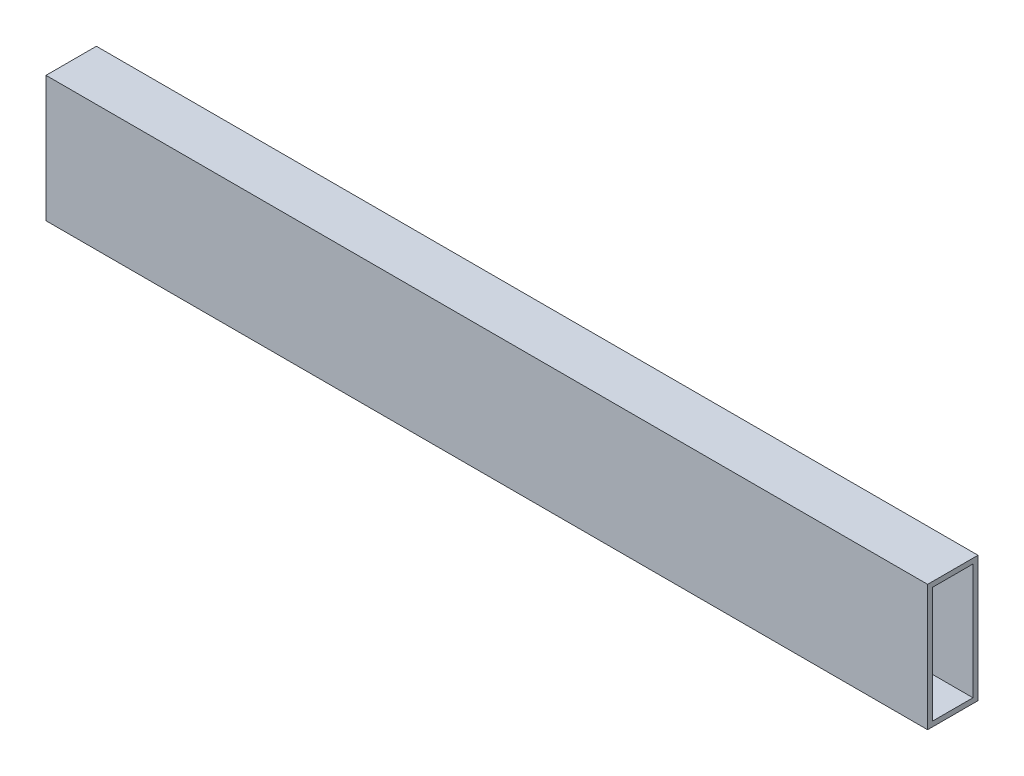
ISO-10303-21;
HEADER;
FILE_DESCRIPTION(('STEP AP214'),'2;1');
FILE_NAME('part.step','',(''),(''),'','','');
FILE_SCHEMA(('AUTOMOTIVE_DESIGN { 1 0 10303 214 1 1 1 1 }'));
ENDSEC;
DATA;
#1=APPLICATION_CONTEXT('core data for automotive mechanical design processes');
#2=APPLICATION_PROTOCOL_DEFINITION('international standard','automotive_design',2000,#1);
#3=PRODUCT_CONTEXT('',#1,'mechanical');
#4=PRODUCT('Part','Part','',(#3));
#5=PRODUCT_RELATED_PRODUCT_CATEGORY('part','',(#4));
#6=PRODUCT_DEFINITION_FORMATION('','',#4);
#7=PRODUCT_DEFINITION_CONTEXT('part definition',#1,'design');
#8=PRODUCT_DEFINITION('design','',#6,#7);
#9=PRODUCT_DEFINITION_SHAPE('','',#8);
#10=(LENGTH_UNIT() NAMED_UNIT(*) SI_UNIT(.MILLI.,.METRE.));
#11=(NAMED_UNIT(*) PLANE_ANGLE_UNIT() SI_UNIT($,.RADIAN.));
#12=(NAMED_UNIT(*) SI_UNIT($,.STERADIAN.) SOLID_ANGLE_UNIT());
#13=UNCERTAINTY_MEASURE_WITH_UNIT(LENGTH_MEASURE(1.E-05),#10,'distance_accuracy_value','');
#14=(GEOMETRIC_REPRESENTATION_CONTEXT(3) GLOBAL_UNCERTAINTY_ASSIGNED_CONTEXT((#13)) GLOBAL_UNIT_ASSIGNED_CONTEXT((#10,
#11,#12)) REPRESENTATION_CONTEXT('',''));
#15=CARTESIAN_POINT('',(0.,0.,0.));
#16=DIRECTION('',(0.,0.,1.));
#17=DIRECTION('',(1.,0.,0.));
#18=AXIS2_PLACEMENT_3D('',#15,#16,#17);
#19=CARTESIAN_POINT('',(350.,0.,0.));
#20=DIRECTION('',(-1.,0.,0.));
#21=DIRECTION('',(0.,0.,1.));
#22=AXIS2_PLACEMENT_3D('',#19,#20,#21);
#23=PLANE('',#22);
#24=DIRECTION('',(0.,1.,0.));
#25=VECTOR('',#24,1.);
#26=CARTESIAN_POINT('',(350.,-25.,-10.));
#27=LINE('',#26,#25);
#28=CARTESIAN_POINT('',(350.,-25.,-10.));
#29=VERTEX_POINT('',#28);
#30=CARTESIAN_POINT('',(350.,25.,-10.));
#31=VERTEX_POINT('',#30);
#32=EDGE_CURVE('E153',#29,#31,#27,.T.);
#33=ORIENTED_EDGE('',*,*,#32,.T.);
#34=DIRECTION('',(0.,0.,1.));
#35=VECTOR('',#34,1.);
#36=CARTESIAN_POINT('',(350.,25.,10.));
#37=LINE('',#36,#35);
#38=CARTESIAN_POINT('',(350.,25.,10.));
#39=VERTEX_POINT('',#38);
#40=EDGE_CURVE('E157',#31,#39,#37,.T.);
#41=ORIENTED_EDGE('',*,*,#40,.T.);
#42=DIRECTION('',(0.,-1.,0.));
#43=VECTOR('',#42,1.);
#44=CARTESIAN_POINT('',(350.,-25.,10.));
#45=LINE('',#44,#43);
#46=CARTESIAN_POINT('',(350.,-25.,10.));
#47=VERTEX_POINT('',#46);
#48=EDGE_CURVE('E161',#39,#47,#45,.T.);
#49=ORIENTED_EDGE('',*,*,#48,.T.);
#50=DIRECTION('',(0.,0.,-1.));
#51=VECTOR('',#50,1.);
#52=CARTESIAN_POINT('',(350.,-25.,10.));
#53=LINE('',#52,#51);
#54=EDGE_CURVE('E164',#47,#29,#53,.T.);
#55=ORIENTED_EDGE('',*,*,#54,.T.);
#56=EDGE_LOOP('',(#33,#41,#49,#55));
#57=FACE_BOUND('',#56,.T.);
#58=DIRECTION('',(0.,1.,0.));
#59=VECTOR('',#58,1.);
#60=CARTESIAN_POINT('',(350.,-23.,-7.99999999999999));
#61=LINE('',#60,#59);
#62=CARTESIAN_POINT('',(350.,-23.,-7.99999999999999));
#63=VERTEX_POINT('',#62);
#64=CARTESIAN_POINT('',(350.,23.,-7.99999999999999));
#65=VERTEX_POINT('',#64);
#66=EDGE_CURVE('E105',#63,#65,#61,.T.);
#67=ORIENTED_EDGE('',*,*,#66,.F.);
#68=DIRECTION('',(0.,0.,-1.));
#69=VECTOR('',#68,1.);
#70=CARTESIAN_POINT('',(350.,-23.,8.));
#71=LINE('',#70,#69);
#72=CARTESIAN_POINT('',(350.,-23.,8.));
#73=VERTEX_POINT('',#72);
#74=EDGE_CURVE('E131',#73,#63,#71,.T.);
#75=ORIENTED_EDGE('',*,*,#74,.F.);
#76=DIRECTION('',(0.,-1.,0.));
#77=VECTOR('',#76,1.);
#78=CARTESIAN_POINT('',(350.,-23.,8.));
#79=LINE('',#78,#77);
#80=CARTESIAN_POINT('',(350.,23.,8.));
#81=VERTEX_POINT('',#80);
#82=EDGE_CURVE('E127',#81,#73,#79,.T.);
#83=ORIENTED_EDGE('',*,*,#82,.F.);
#84=DIRECTION('',(0.,0.,1.));
#85=VECTOR('',#84,1.);
#86=CARTESIAN_POINT('',(350.,23.,8.));
#87=LINE('',#86,#85);
#88=EDGE_CURVE('E114',#65,#81,#87,.T.);
#89=ORIENTED_EDGE('',*,*,#88,.F.);
#90=EDGE_LOOP('',(#67,#75,#83,#89));
#91=FACE_BOUND('',#90,.T.);
#92=ADVANCED_FACE('F39',(#57,#91),#23,.F.);
#93=CARTESIAN_POINT('',(0.,0.,0.));
#94=DIRECTION('',(-1.,0.,0.));
#95=DIRECTION('',(0.,0.,1.));
#96=AXIS2_PLACEMENT_3D('',#93,#94,#95);
#97=PLANE('',#96);
#98=DIRECTION('',(0.,1.,0.));
#99=VECTOR('',#98,1.);
#100=CARTESIAN_POINT('',(0.,-25.,-10.));
#101=LINE('',#100,#99);
#102=CARTESIAN_POINT('',(0.,-25.,-10.));
#103=VERTEX_POINT('',#102);
#104=CARTESIAN_POINT('',(0.,25.,-10.));
#105=VERTEX_POINT('',#104);
#106=EDGE_CURVE('E123',#103,#105,#101,.T.);
#107=ORIENTED_EDGE('',*,*,#106,.F.);
#108=DIRECTION('',(0.,0.,-1.));
#109=VECTOR('',#108,1.);
#110=CARTESIAN_POINT('',(0.,-25.,10.));
#111=LINE('',#110,#109);
#112=CARTESIAN_POINT('',(0.,-25.,10.));
#113=VERTEX_POINT('',#112);
#114=EDGE_CURVE('E158',#113,#103,#111,.T.);
#115=ORIENTED_EDGE('',*,*,#114,.F.);
#116=DIRECTION('',(0.,-1.,0.));
#117=VECTOR('',#116,1.);
#118=CARTESIAN_POINT('',(0.,-25.,10.));
#119=LINE('',#118,#117);
#120=CARTESIAN_POINT('',(0.,25.,10.));
#121=VERTEX_POINT('',#120);
#122=EDGE_CURVE('E174',#121,#113,#119,.T.);
#123=ORIENTED_EDGE('',*,*,#122,.F.);
#124=DIRECTION('',(0.,0.,1.));
#125=VECTOR('',#124,1.);
#126=CARTESIAN_POINT('',(0.,25.,10.));
#127=LINE('',#126,#125);
#128=EDGE_CURVE('E171',#105,#121,#127,.T.);
#129=ORIENTED_EDGE('',*,*,#128,.F.);
#130=EDGE_LOOP('',(#107,#115,#123,#129));
#131=FACE_BOUND('',#130,.T.);
#132=DIRECTION('',(0.,0.,-1.));
#133=VECTOR('',#132,1.);
#134=CARTESIAN_POINT('',(0.,-23.,8.));
#135=LINE('',#134,#133);
#136=CARTESIAN_POINT('',(0.,-23.,8.));
#137=VERTEX_POINT('',#136);
#138=CARTESIAN_POINT('',(0.,-23.,-7.99999999999999));
#139=VERTEX_POINT('',#138);
#140=EDGE_CURVE('E115',#137,#139,#135,.T.);
#141=ORIENTED_EDGE('',*,*,#140,.T.);
#142=DIRECTION('',(0.,1.,0.));
#143=VECTOR('',#142,1.);
#144=CARTESIAN_POINT('',(0.,-23.,-7.99999999999999));
#145=LINE('',#144,#143);
#146=CARTESIAN_POINT('',(0.,23.,-7.99999999999999));
#147=VERTEX_POINT('',#146);
#148=EDGE_CURVE('E63',#139,#147,#145,.T.);
#149=ORIENTED_EDGE('',*,*,#148,.T.);
#150=DIRECTION('',(0.,0.,1.));
#151=VECTOR('',#150,1.);
#152=CARTESIAN_POINT('',(0.,23.,8.));
#153=LINE('',#152,#151);
#154=CARTESIAN_POINT('',(0.,23.,8.));
#155=VERTEX_POINT('',#154);
#156=EDGE_CURVE('E121',#147,#155,#153,.T.);
#157=ORIENTED_EDGE('',*,*,#156,.T.);
#158=DIRECTION('',(0.,-1.,0.));
#159=VECTOR('',#158,1.);
#160=CARTESIAN_POINT('',(0.,-23.,8.));
#161=LINE('',#160,#159);
#162=EDGE_CURVE('E140',#155,#137,#161,.T.);
#163=ORIENTED_EDGE('',*,*,#162,.T.);
#164=EDGE_LOOP('',(#141,#149,#157,#163));
#165=FACE_BOUND('',#164,.T.);
#166=ADVANCED_FACE('F197',(#131,#165),#97,.T.);
#167=CARTESIAN_POINT('',(350.,-25.,-10.));
#168=DIRECTION('',(0.,0.,1.));
#169=DIRECTION('',(1.,0.,0.));
#170=AXIS2_PLACEMENT_3D('',#167,#168,#169);
#171=PLANE('',#170);
#172=ORIENTED_EDGE('',*,*,#106,.T.);
#173=DIRECTION('',(-1.,0.,0.));
#174=VECTOR('',#173,1.);
#175=CARTESIAN_POINT('',(350.,25.,-10.));
#176=LINE('',#175,#174);
#177=EDGE_CURVE('E11',#31,#105,#176,.T.);
#178=ORIENTED_EDGE('',*,*,#177,.F.);
#179=ORIENTED_EDGE('',*,*,#32,.F.);
#180=DIRECTION('',(-1.,0.,0.));
#181=VECTOR('',#180,1.);
#182=CARTESIAN_POINT('',(350.,-25.,-10.));
#183=LINE('',#182,#181);
#184=EDGE_CURVE('E167',#29,#103,#183,.T.);
#185=ORIENTED_EDGE('',*,*,#184,.T.);
#186=EDGE_LOOP('',(#172,#178,#179,#185));
#187=FACE_BOUND('',#186,.T.);
#188=ADVANCED_FACE('F41',(#187),#171,.F.);
#189=CARTESIAN_POINT('',(350.,25.,10.));
#190=DIRECTION('',(0.,-1.,0.));
#191=DIRECTION('',(0.,0.,-1.));
#192=AXIS2_PLACEMENT_3D('',#189,#190,#191);
#193=PLANE('',#192);
#194=ORIENTED_EDGE('',*,*,#128,.T.);
#195=DIRECTION('',(-1.,0.,0.));
#196=VECTOR('',#195,1.);
#197=CARTESIAN_POINT('',(350.,25.,10.));
#198=LINE('',#197,#196);
#199=EDGE_CURVE('E48',#39,#121,#198,.T.);
#200=ORIENTED_EDGE('',*,*,#199,.F.);
#201=ORIENTED_EDGE('',*,*,#40,.F.);
#202=ORIENTED_EDGE('',*,*,#177,.T.);
#203=EDGE_LOOP('',(#194,#200,#201,#202));
#204=FACE_BOUND('',#203,.T.);
#205=ADVANCED_FACE('F207',(#204),#193,.F.);
#206=CARTESIAN_POINT('',(350.,-25.,10.));
#207=DIRECTION('',(0.,0.,-1.));
#208=DIRECTION('',(-1.,0.,0.));
#209=AXIS2_PLACEMENT_3D('',#206,#207,#208);
#210=PLANE('',#209);
#211=ORIENTED_EDGE('',*,*,#122,.T.);
#212=DIRECTION('',(-1.,0.,0.));
#213=VECTOR('',#212,1.);
#214=CARTESIAN_POINT('',(350.,-25.,10.));
#215=LINE('',#214,#213);
#216=EDGE_CURVE('E182',#47,#113,#215,.T.);
#217=ORIENTED_EDGE('',*,*,#216,.F.);
#218=ORIENTED_EDGE('',*,*,#48,.F.);
#219=ORIENTED_EDGE('',*,*,#199,.T.);
#220=EDGE_LOOP('',(#211,#217,#218,#219));
#221=FACE_BOUND('',#220,.T.);
#222=ADVANCED_FACE('F191',(#221),#210,.F.);
#223=CARTESIAN_POINT('',(350.,-25.,10.));
#224=DIRECTION('',(0.,1.,0.));
#225=DIRECTION('',(0.,0.,1.));
#226=AXIS2_PLACEMENT_3D('',#223,#224,#225);
#227=PLANE('',#226);
#228=ORIENTED_EDGE('',*,*,#114,.T.);
#229=ORIENTED_EDGE('',*,*,#184,.F.);
#230=ORIENTED_EDGE('',*,*,#54,.F.);
#231=ORIENTED_EDGE('',*,*,#216,.T.);
#232=EDGE_LOOP('',(#228,#229,#230,#231));
#233=FACE_BOUND('',#232,.T.);
#234=ADVANCED_FACE('F201',(#233),#227,.F.);
#235=CARTESIAN_POINT('',(350.,-23.,-7.99999999999999));
#236=DIRECTION('',(0.,0.,1.));
#237=DIRECTION('',(1.,0.,0.));
#238=AXIS2_PLACEMENT_3D('',#235,#236,#237);
#239=PLANE('',#238);
#240=ORIENTED_EDGE('',*,*,#148,.F.);
#241=DIRECTION('',(-1.,0.,0.));
#242=VECTOR('',#241,1.);
#243=CARTESIAN_POINT('',(350.,-23.,-7.99999999999999));
#244=LINE('',#243,#242);
#245=EDGE_CURVE('E109',#63,#139,#244,.T.);
#246=ORIENTED_EDGE('',*,*,#245,.F.);
#247=ORIENTED_EDGE('',*,*,#66,.T.);
#248=DIRECTION('',(-1.,0.,0.));
#249=VECTOR('',#248,1.);
#250=CARTESIAN_POINT('',(350.,23.,-7.99999999999999));
#251=LINE('',#250,#249);
#252=EDGE_CURVE('E108',#65,#147,#251,.T.);
#253=ORIENTED_EDGE('',*,*,#252,.T.);
#254=EDGE_LOOP('',(#240,#246,#247,#253));
#255=FACE_BOUND('',#254,.T.);
#256=ADVANCED_FACE('F107',(#255),#239,.T.);
#257=CARTESIAN_POINT('',(350.,23.,8.));
#258=DIRECTION('',(0.,-1.,0.));
#259=DIRECTION('',(0.,0.,-1.));
#260=AXIS2_PLACEMENT_3D('',#257,#258,#259);
#261=PLANE('',#260);
#262=ORIENTED_EDGE('',*,*,#156,.F.);
#263=ORIENTED_EDGE('',*,*,#252,.F.);
#264=ORIENTED_EDGE('',*,*,#88,.T.);
#265=DIRECTION('',(-1.,0.,0.));
#266=VECTOR('',#265,1.);
#267=CARTESIAN_POINT('',(350.,23.,8.));
#268=LINE('',#267,#266);
#269=EDGE_CURVE('E124',#81,#155,#268,.T.);
#270=ORIENTED_EDGE('',*,*,#269,.T.);
#271=EDGE_LOOP('',(#262,#263,#264,#270));
#272=FACE_BOUND('',#271,.T.);
#273=ADVANCED_FACE('F118',(#272),#261,.T.);
#274=CARTESIAN_POINT('',(350.,-23.,8.));
#275=DIRECTION('',(0.,0.,-1.));
#276=DIRECTION('',(-1.,0.,0.));
#277=AXIS2_PLACEMENT_3D('',#274,#275,#276);
#278=PLANE('',#277);
#279=ORIENTED_EDGE('',*,*,#162,.F.);
#280=ORIENTED_EDGE('',*,*,#269,.F.);
#281=ORIENTED_EDGE('',*,*,#82,.T.);
#282=DIRECTION('',(-1.,0.,0.));
#283=VECTOR('',#282,1.);
#284=CARTESIAN_POINT('',(350.,-23.,8.));
#285=LINE('',#284,#283);
#286=EDGE_CURVE('E55',#73,#137,#285,.T.);
#287=ORIENTED_EDGE('',*,*,#286,.T.);
#288=EDGE_LOOP('',(#279,#280,#281,#287));
#289=FACE_BOUND('',#288,.T.);
#290=ADVANCED_FACE('F230',(#289),#278,.T.);
#291=CARTESIAN_POINT('',(350.,-23.,8.));
#292=DIRECTION('',(0.,1.,0.));
#293=DIRECTION('',(0.,0.,1.));
#294=AXIS2_PLACEMENT_3D('',#291,#292,#293);
#295=PLANE('',#294);
#296=ORIENTED_EDGE('',*,*,#140,.F.);
#297=ORIENTED_EDGE('',*,*,#286,.F.);
#298=ORIENTED_EDGE('',*,*,#74,.T.);
#299=ORIENTED_EDGE('',*,*,#245,.T.);
#300=EDGE_LOOP('',(#296,#297,#298,#299));
#301=FACE_BOUND('',#300,.T.);
#302=ADVANCED_FACE('F234',(#301),#295,.T.);
#303=CLOSED_SHELL('',(#92,#166,#188,#205,#222,#234,#256,#273,#290,#302));
#304=MANIFOLD_SOLID_BREP('B2',#303);
#305=ADVANCED_BREP_SHAPE_REPRESENTATION('',(#18,#304),#14);
#306=SHAPE_DEFINITION_REPRESENTATION(#9,#305);
ENDSEC;
END-ISO-10303-21;
